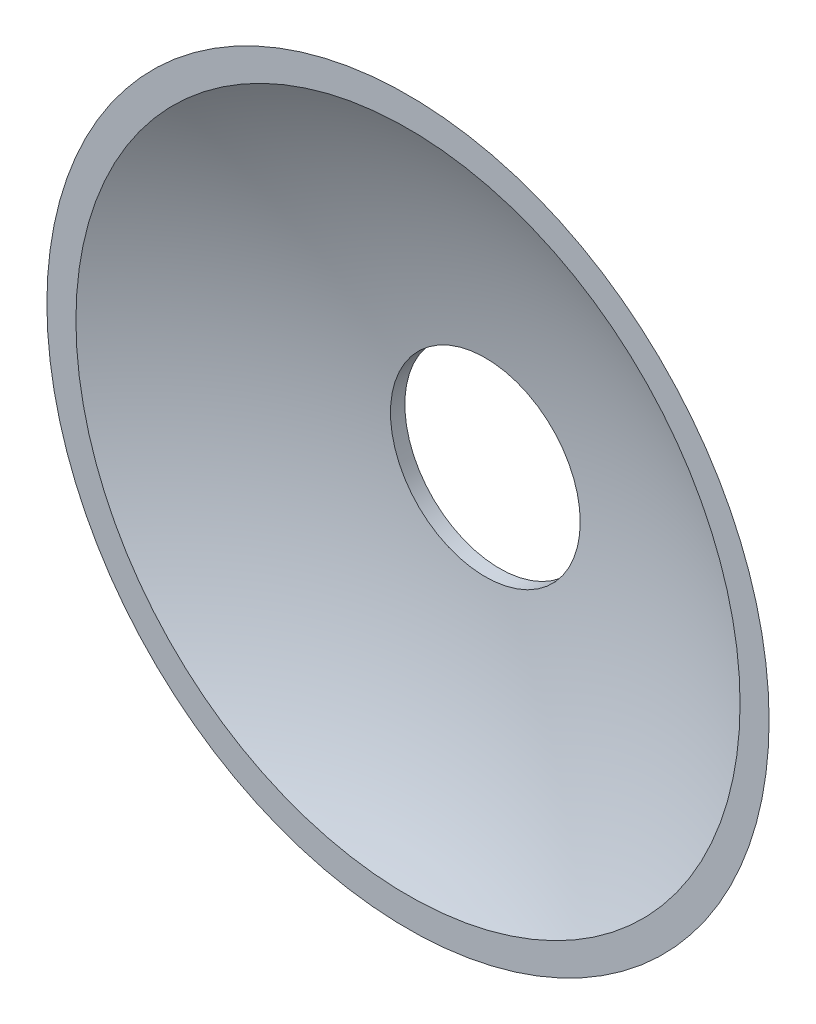
ISO-10303-21;
HEADER;
FILE_DESCRIPTION(('STEP AP214'),'2;1');
FILE_NAME('part.step','',(''),(''),'','','');
FILE_SCHEMA(('AUTOMOTIVE_DESIGN { 1 0 10303 214 1 1 1 1 }'));
ENDSEC;
DATA;
#1=APPLICATION_CONTEXT('core data for automotive mechanical design processes');
#2=APPLICATION_PROTOCOL_DEFINITION('international standard','automotive_design',2000,#1);
#3=PRODUCT_CONTEXT('',#1,'mechanical');
#4=PRODUCT('Part','Part','',(#3));
#5=PRODUCT_RELATED_PRODUCT_CATEGORY('part','',(#4));
#6=PRODUCT_DEFINITION_FORMATION('','',#4);
#7=PRODUCT_DEFINITION_CONTEXT('part definition',#1,'design');
#8=PRODUCT_DEFINITION('design','',#6,#7);
#9=PRODUCT_DEFINITION_SHAPE('','',#8);
#10=(LENGTH_UNIT() NAMED_UNIT(*) SI_UNIT(.MILLI.,.METRE.));
#11=(NAMED_UNIT(*) PLANE_ANGLE_UNIT() SI_UNIT($,.RADIAN.));
#12=(NAMED_UNIT(*) SI_UNIT($,.STERADIAN.) SOLID_ANGLE_UNIT());
#13=UNCERTAINTY_MEASURE_WITH_UNIT(LENGTH_MEASURE(1.E-05),#10,'distance_accuracy_value','');
#14=(GEOMETRIC_REPRESENTATION_CONTEXT(3) GLOBAL_UNCERTAINTY_ASSIGNED_CONTEXT((#13)) GLOBAL_UNIT_ASSIGNED_CONTEXT((#10,
#11,#12)) REPRESENTATION_CONTEXT('',''));
#15=CARTESIAN_POINT('',(0.,0.,0.));
#16=DIRECTION('',(0.,0.,1.));
#17=DIRECTION('',(1.,0.,0.));
#18=AXIS2_PLACEMENT_3D('',#15,#16,#17);
#19=CARTESIAN_POINT('',(0.,0.,-129.832));
#20=DIRECTION('',(0.,0.,1.));
#21=DIRECTION('',(1.,0.,0.));
#22=AXIS2_PLACEMENT_3D('',#19,#20,#21);
#23=PLANE('',#22);
#24=CARTESIAN_POINT('',(0.,0.,-129.832));
#25=DIRECTION('',(0.,0.,1.));
#26=DIRECTION('',(1.,0.,0.));
#27=AXIS2_PLACEMENT_3D('',#24,#25,#26);
#28=CIRCLE('',#27,76.1176837272391);
#29=CARTESIAN_POINT('',(76.1176837272391,0.,-129.832));
#30=VERTEX_POINT('',#29);
#31=EDGE_CURVE('E47',#30,#30,#28,.F.);
#32=ORIENTED_EDGE('',*,*,#31,.F.);
#33=EDGE_LOOP('',(#32));
#34=FACE_BOUND('',#33,.T.);
#35=CARTESIAN_POINT('',(0.,0.,-129.832));
#36=DIRECTION('',(0.,0.,1.));
#37=DIRECTION('',(1.,0.,0.));
#38=AXIS2_PLACEMENT_3D('',#35,#36,#37);
#39=CIRCLE('',#38,69.9992983964839);
#40=CARTESIAN_POINT('',(69.9992983964839,0.,-129.832));
#41=VERTEX_POINT('',#40);
#42=EDGE_CURVE('E10',#41,#41,#39,.T.);
#43=ORIENTED_EDGE('',*,*,#42,.F.);
#44=EDGE_LOOP('',(#43));
#45=FACE_BOUND('',#44,.T.);
#46=ADVANCED_FACE('F39',(#34,#45),#23,.T.);
#47=CARTESIAN_POINT('',(0.,0.,0.));
#48=DIRECTION('',(0.,-1.,0.));
#49=DIRECTION('',(1.,0.,0.));
#50=AXIS2_PLACEMENT_3D('',#47,#48,#49);
#51=SPHERICAL_SURFACE('',#50,147.5);
#52=CARTESIAN_POINT('',(0.,0.,0.));
#53=DIRECTION('',(0.,0.,1.));
#54=DIRECTION('',(1.,0.,0.));
#55=AXIS2_PLACEMENT_3D('',#52,#53,#54);
#56=SPHERICAL_SURFACE('',#55,147.5);
#57=CARTESIAN_POINT('',(0.,0.,-146.137777456755));
#58=DIRECTION('',(0.,0.,1.));
#59=DIRECTION('',(1.,0.,0.));
#60=AXIS2_PLACEMENT_3D('',#57,#58,#59);
#61=CIRCLE('',#60,20.);
#62=CARTESIAN_POINT('',(20.,0.,-146.137777456755));
#63=VERTEX_POINT('',#62);
#64=EDGE_CURVE('E52',#63,#63,#61,.T.);
#65=ORIENTED_EDGE('',*,*,#64,.F.);
#66=EDGE_LOOP('',(#65));
#67=FACE_BOUND('',#66,.T.);
#68=ORIENTED_EDGE('',*,*,#42,.T.);
#69=EDGE_LOOP('',(#68));
#70=FACE_BOUND('',#69,.T.);
#71=ADVANCED_FACE('F64',(#67,#70),#56,.F.);
#72=CARTESIAN_POINT('',(0.,0.,0.));
#73=DIRECTION('',(0.,-1.,0.));
#74=DIRECTION('',(-1.,0.,0.));
#75=AXIS2_PLACEMENT_3D('',#72,#73,#74);
#76=SPHERICAL_SURFACE('',#75,150.5);
#77=CARTESIAN_POINT('',(0.,0.,0.));
#78=DIRECTION('',(0.,0.,1.));
#79=DIRECTION('',(1.,0.,0.));
#80=AXIS2_PLACEMENT_3D('',#77,#78,#79);
#81=SPHERICAL_SURFACE('',#80,150.5);
#82=CARTESIAN_POINT('',(0.,0.,-149.165176901313));
#83=DIRECTION('',(0.,0.,1.));
#84=DIRECTION('',(1.,0.,0.));
#85=AXIS2_PLACEMENT_3D('',#82,#83,#84);
#86=CIRCLE('',#85,20.);
#87=CARTESIAN_POINT('',(20.,0.,-149.165176901313));
#88=VERTEX_POINT('',#87);
#89=EDGE_CURVE('E43',#88,#88,#86,.F.);
#90=ORIENTED_EDGE('',*,*,#89,.F.);
#91=EDGE_LOOP('',(#90));
#92=FACE_BOUND('',#91,.T.);
#93=ORIENTED_EDGE('',*,*,#31,.T.);
#94=EDGE_LOOP('',(#93));
#95=FACE_BOUND('',#94,.T.);
#96=ADVANCED_FACE('F41',(#92,#95),#81,.T.);
#97=CARTESIAN_POINT('',(0.,0.,-150.5));
#98=DIRECTION('',(0.,0.,1.));
#99=DIRECTION('',(1.,0.,0.));
#100=AXIS2_PLACEMENT_3D('',#97,#98,#99);
#101=CYLINDRICAL_SURFACE('',#100,20.);
#102=ORIENTED_EDGE('',*,*,#64,.T.);
#103=EDGE_LOOP('',(#102));
#104=FACE_BOUND('',#103,.T.);
#105=ORIENTED_EDGE('',*,*,#89,.T.);
#106=EDGE_LOOP('',(#105));
#107=FACE_BOUND('',#106,.T.);
#108=ADVANCED_FACE('F60',(#104,#107),#101,.F.);
#109=CLOSED_SHELL('',(#46,#71,#96,#108));
#110=MANIFOLD_SOLID_BREP('B2',#109);
#111=ADVANCED_BREP_SHAPE_REPRESENTATION('',(#18,#110),#14);
#112=SHAPE_DEFINITION_REPRESENTATION(#9,#111);
ENDSEC;
END-ISO-10303-21;
